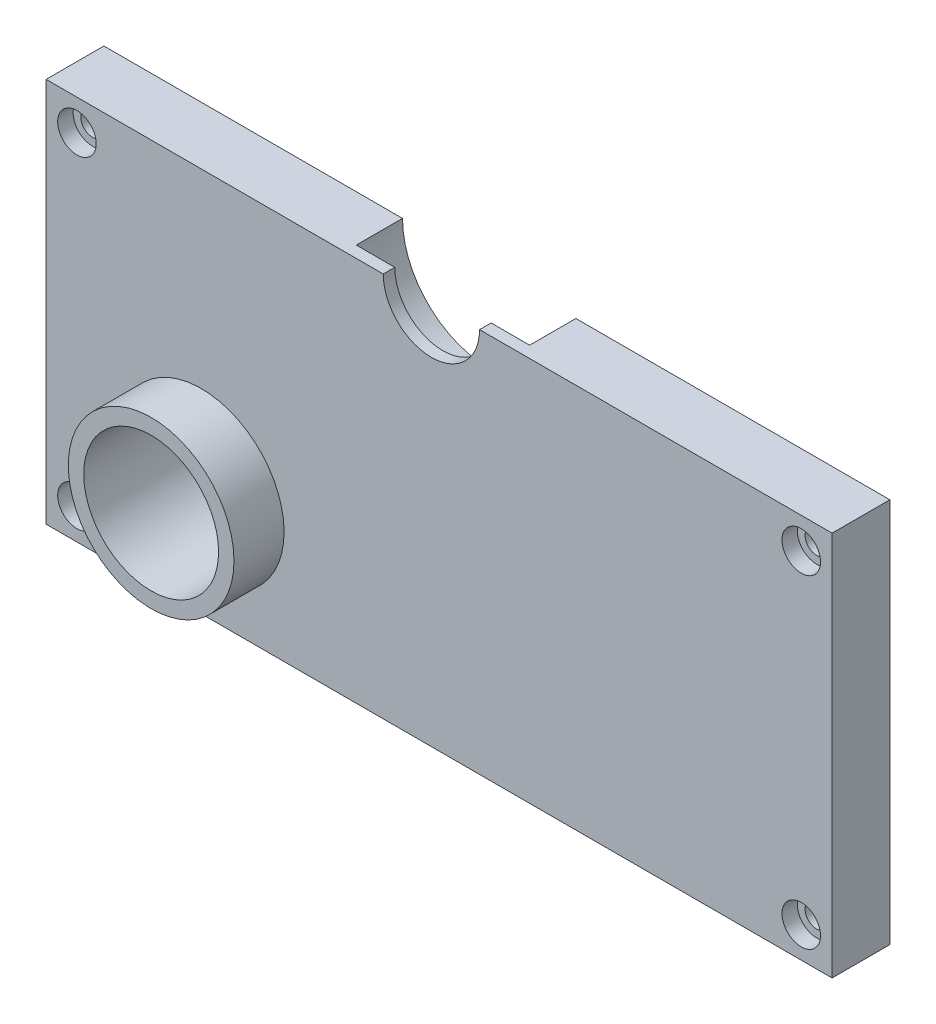
ISO-10303-21;
HEADER;
FILE_DESCRIPTION(('STEP AP214'),'2;1');
FILE_NAME('part.step','',(''),(''),'','','');
FILE_SCHEMA(('AUTOMOTIVE_DESIGN { 1 0 10303 214 1 1 1 1 }'));
ENDSEC;
DATA;
#1=APPLICATION_CONTEXT('core data for automotive mechanical design processes');
#2=APPLICATION_PROTOCOL_DEFINITION('international standard','automotive_design',2000,#1);
#3=PRODUCT_CONTEXT('',#1,'mechanical');
#4=PRODUCT('Part','Part','',(#3));
#5=PRODUCT_RELATED_PRODUCT_CATEGORY('part','',(#4));
#6=PRODUCT_DEFINITION_FORMATION('','',#4);
#7=PRODUCT_DEFINITION_CONTEXT('part definition',#1,'design');
#8=PRODUCT_DEFINITION('design','',#6,#7);
#9=PRODUCT_DEFINITION_SHAPE('','',#8);
#10=(LENGTH_UNIT() NAMED_UNIT(*) SI_UNIT(.MILLI.,.METRE.));
#11=(NAMED_UNIT(*) PLANE_ANGLE_UNIT() SI_UNIT($,.RADIAN.));
#12=(NAMED_UNIT(*) SI_UNIT($,.STERADIAN.) SOLID_ANGLE_UNIT());
#13=UNCERTAINTY_MEASURE_WITH_UNIT(LENGTH_MEASURE(1.E-05),#10,'distance_accuracy_value','');
#14=(GEOMETRIC_REPRESENTATION_CONTEXT(3) GLOBAL_UNCERTAINTY_ASSIGNED_CONTEXT((#13)) GLOBAL_UNIT_ASSIGNED_CONTEXT((#10,
#11,#12)) REPRESENTATION_CONTEXT('',''));
#15=CARTESIAN_POINT('',(0.,0.,0.));
#16=DIRECTION('',(0.,0.,1.));
#17=DIRECTION('',(1.,0.,0.));
#18=AXIS2_PLACEMENT_3D('',#15,#16,#17);
#19=CARTESIAN_POINT('',(-46.,-46.,-5.5));
#20=DIRECTION('',(0.,0.,1.));
#21=DIRECTION('',(1.,0.,0.));
#22=AXIS2_PLACEMENT_3D('',#19,#20,#21);
#23=CYLINDRICAL_SURFACE('',#22,1.5);
#24=CARTESIAN_POINT('',(-46.,-46.,-3.));
#25=DIRECTION('',(0.,0.,-1.));
#26=DIRECTION('',(-1.,0.,0.));
#27=AXIS2_PLACEMENT_3D('',#24,#25,#26);
#28=CIRCLE('',#27,1.5);
#29=CARTESIAN_POINT('',(-47.5,-46.,-3.));
#30=VERTEX_POINT('',#29);
#31=EDGE_CURVE('E275',#30,#30,#28,.T.);
#32=ORIENTED_EDGE('',*,*,#31,.T.);
#33=EDGE_LOOP('',(#32));
#34=FACE_BOUND('',#33,.T.);
#35=CARTESIAN_POINT('',(-46.,-46.,2.5));
#36=DIRECTION('',(0.,0.,1.));
#37=DIRECTION('',(1.,0.,0.));
#38=AXIS2_PLACEMENT_3D('',#35,#36,#37);
#39=CIRCLE('',#38,1.5);
#40=CARTESIAN_POINT('',(-44.5,-46.,2.5));
#41=VERTEX_POINT('',#40);
#42=EDGE_CURVE('E41',#41,#41,#39,.F.);
#43=ORIENTED_EDGE('',*,*,#42,.F.);
#44=EDGE_LOOP('',(#43));
#45=FACE_BOUND('',#44,.T.);
#46=ADVANCED_FACE('F37',(#34,#45),#23,.F.);
#47=CARTESIAN_POINT('',(48.,-46.,-5.5));
#48=DIRECTION('',(0.,0.,1.));
#49=DIRECTION('',(1.,0.,0.));
#50=AXIS2_PLACEMENT_3D('',#47,#48,#49);
#51=CYLINDRICAL_SURFACE('',#50,1.5);
#52=CARTESIAN_POINT('',(48.,-46.,-3.));
#53=DIRECTION('',(0.,0.,-1.));
#54=DIRECTION('',(-1.,0.,0.));
#55=AXIS2_PLACEMENT_3D('',#52,#53,#54);
#56=CIRCLE('',#55,1.5);
#57=CARTESIAN_POINT('',(46.5,-46.,-3.));
#58=VERTEX_POINT('',#57);
#59=EDGE_CURVE('E277',#58,#58,#56,.T.);
#60=ORIENTED_EDGE('',*,*,#59,.T.);
#61=EDGE_LOOP('',(#60));
#62=FACE_BOUND('',#61,.T.);
#63=CARTESIAN_POINT('',(48.,-46.,2.5));
#64=DIRECTION('',(0.,0.,1.));
#65=DIRECTION('',(1.,0.,0.));
#66=AXIS2_PLACEMENT_3D('',#63,#64,#65);
#67=CIRCLE('',#66,1.5);
#68=CARTESIAN_POINT('',(49.5,-46.,2.5));
#69=VERTEX_POINT('',#68);
#70=EDGE_CURVE('E355',#69,#69,#67,.F.);
#71=ORIENTED_EDGE('',*,*,#70,.F.);
#72=EDGE_LOOP('',(#71));
#73=FACE_BOUND('',#72,.T.);
#74=ADVANCED_FACE('F242',(#62,#73),#51,.F.);
#75=CARTESIAN_POINT('',(48.,-4.,-5.5));
#76=DIRECTION('',(0.,0.,1.));
#77=DIRECTION('',(1.,0.,0.));
#78=AXIS2_PLACEMENT_3D('',#75,#76,#77);
#79=CYLINDRICAL_SURFACE('',#78,1.5);
#80=CARTESIAN_POINT('',(48.,-4.,-3.));
#81=DIRECTION('',(0.,0.,-1.));
#82=DIRECTION('',(-1.,0.,0.));
#83=AXIS2_PLACEMENT_3D('',#80,#81,#82);
#84=CIRCLE('',#83,1.5);
#85=CARTESIAN_POINT('',(46.5,-4.,-3.));
#86=VERTEX_POINT('',#85);
#87=EDGE_CURVE('E293',#86,#86,#84,.T.);
#88=ORIENTED_EDGE('',*,*,#87,.T.);
#89=EDGE_LOOP('',(#88));
#90=FACE_BOUND('',#89,.T.);
#91=CARTESIAN_POINT('',(48.,-4.,2.5));
#92=DIRECTION('',(0.,0.,1.));
#93=DIRECTION('',(1.,0.,0.));
#94=AXIS2_PLACEMENT_3D('',#91,#92,#93);
#95=CIRCLE('',#94,1.5);
#96=CARTESIAN_POINT('',(49.5,-4.,2.5));
#97=VERTEX_POINT('',#96);
#98=EDGE_CURVE('E285',#97,#97,#95,.F.);
#99=ORIENTED_EDGE('',*,*,#98,.F.);
#100=EDGE_LOOP('',(#99));
#101=FACE_BOUND('',#100,.T.);
#102=ADVANCED_FACE('F249',(#90,#101),#79,.F.);
#103=CARTESIAN_POINT('',(-46.,-4.,-5.5));
#104=DIRECTION('',(0.,0.,1.));
#105=DIRECTION('',(1.,0.,0.));
#106=AXIS2_PLACEMENT_3D('',#103,#104,#105);
#107=CYLINDRICAL_SURFACE('',#106,1.5);
#108=CARTESIAN_POINT('',(-46.,-4.,-3.));
#109=DIRECTION('',(0.,0.,-1.));
#110=DIRECTION('',(-1.,0.,0.));
#111=AXIS2_PLACEMENT_3D('',#108,#109,#110);
#112=CIRCLE('',#111,1.5);
#113=CARTESIAN_POINT('',(-47.5,-4.,-3.));
#114=VERTEX_POINT('',#113);
#115=EDGE_CURVE('E271',#114,#114,#112,.T.);
#116=ORIENTED_EDGE('',*,*,#115,.T.);
#117=EDGE_LOOP('',(#116));
#118=FACE_BOUND('',#117,.T.);
#119=CARTESIAN_POINT('',(-46.,-4.,2.5));
#120=DIRECTION('',(0.,0.,1.));
#121=DIRECTION('',(1.,0.,0.));
#122=AXIS2_PLACEMENT_3D('',#119,#120,#121);
#123=CIRCLE('',#122,1.5);
#124=CARTESIAN_POINT('',(-44.5,-4.,2.5));
#125=VERTEX_POINT('',#124);
#126=EDGE_CURVE('E192',#125,#125,#123,.F.);
#127=ORIENTED_EDGE('',*,*,#126,.F.);
#128=EDGE_LOOP('',(#127));
#129=FACE_BOUND('',#128,.T.);
#130=ADVANCED_FACE('F259',(#118,#129),#107,.F.);
#131=CARTESIAN_POINT('',(-29.87,-35.43,-13.));
#132=DIRECTION('',(0.,0.,1.));
#133=DIRECTION('',(1.,0.,0.));
#134=AXIS2_PLACEMENT_3D('',#131,#132,#133);
#135=CYLINDRICAL_SURFACE('',#134,10.75);
#136=CARTESIAN_POINT('',(-29.87,-35.43,-3.));
#137=DIRECTION('',(0.,0.,-1.));
#138=DIRECTION('',(-1.,0.,0.));
#139=AXIS2_PLACEMENT_3D('',#136,#137,#138);
#140=CIRCLE('',#139,10.75);
#141=CARTESIAN_POINT('',(-40.62,-35.43,-3.));
#142=VERTEX_POINT('',#141);
#143=EDGE_CURVE('E161',#142,#142,#140,.T.);
#144=ORIENTED_EDGE('',*,*,#143,.T.);
#145=EDGE_LOOP('',(#144));
#146=FACE_BOUND('',#145,.T.);
#147=CARTESIAN_POINT('',(-29.87,-35.43,-13.));
#148=DIRECTION('',(0.,0.,-1.));
#149=DIRECTION('',(-1.,0.,0.));
#150=AXIS2_PLACEMENT_3D('',#147,#148,#149);
#151=CIRCLE('',#150,10.75);
#152=CARTESIAN_POINT('',(-40.62,-35.43,-13.));
#153=VERTEX_POINT('',#152);
#154=EDGE_CURVE('E162',#153,#153,#151,.T.);
#155=ORIENTED_EDGE('',*,*,#154,.F.);
#156=EDGE_LOOP('',(#155));
#157=FACE_BOUND('',#156,.T.);
#158=CARTESIAN_POINT('',(-29.87,-24.68,-11.));
#159=CARTESIAN_POINT('',(-30.0350922923654,-24.6800021699373,-10.9999967115362));
#160=CARTESIAN_POINT('',(-30.2002188455206,-24.6838401379829,-10.9863267377588));
#161=CARTESIAN_POINT('',(-30.5256963325227,-24.6987770769157,-10.9321165777898));
#162=CARTESIAN_POINT('',(-30.6860452563237,-24.7098790600518,-10.8915652443178));
#163=CARTESIAN_POINT('',(-30.9972237276783,-24.7381218354101,-10.7850275451856));
#164=CARTESIAN_POINT('',(-31.1480658729212,-24.7552544291121,-10.7190756997178));
#165=CARTESIAN_POINT('',(-31.4365495233022,-24.79375865675,-10.5637420379839));
#166=CARTESIAN_POINT('',(-31.5741898208151,-24.8151306779356,-10.474358081076));
#167=CARTESIAN_POINT('',(-31.8358299020564,-24.8604183025175,-10.2723216958212));
#168=CARTESIAN_POINT('',(-31.9594498397226,-24.8843805755824,-10.1591878258725));
#169=CARTESIAN_POINT('',(-32.1862315221166,-24.9318561737601,-9.91389107583066));
#170=CARTESIAN_POINT('',(-32.2893903588399,-24.9553694346291,-9.78172549548366));
#171=CARTESIAN_POINT('',(-32.4742257804314,-24.9997678486268,-9.49901995034033));
#172=CARTESIAN_POINT('',(-32.5554558575761,-25.0205944262695,-9.34817800376118));
#173=CARTESIAN_POINT('',(-32.6912482965205,-25.0565710848423,-9.03430166362407));
#174=CARTESIAN_POINT('',(-32.7458161003846,-25.0717223240241,-8.87126976600936));
#175=CARTESIAN_POINT('',(-32.8253976057648,-25.0941493559096,-8.54187019285583));
#176=CARTESIAN_POINT('',(-32.8511042820826,-25.1016094413276,-8.37568280112655));
#177=CARTESIAN_POINT('',(-32.8743956182747,-25.1083593011281,-8.0411996136968));
#178=CARTESIAN_POINT('',(-32.871986079965,-25.107650761117,-7.87290426013658));
#179=CARTESIAN_POINT('',(-32.8396614160702,-25.0983077982643,-7.54447062514526));
#180=CARTESIAN_POINT('',(-32.8105951877985,-25.0899180032174,-7.38424071286977));
#181=CARTESIAN_POINT('',(-32.7271461211682,-25.0665509991549,-7.0710276873053));
#182=CARTESIAN_POINT('',(-32.6727610884589,-25.0515732191726,-6.91804520340877));
#183=CARTESIAN_POINT('',(-32.539550741909,-25.0165100029562,-6.62150621295611));
#184=CARTESIAN_POINT('',(-32.4604359190388,-24.9963645990934,-6.47808715012894));
#185=CARTESIAN_POINT('',(-32.2802134221935,-24.9532670119222,-6.20626718558629));
#186=CARTESIAN_POINT('',(-32.1791010516395,-24.9303142296842,-6.07786950002096));
#187=CARTESIAN_POINT('',(-31.9534578101335,-24.8831791462612,-5.83489912100734));
#188=CARTESIAN_POINT('',(-31.8282169856434,-24.8589822753319,-5.72098757492069));
#189=CARTESIAN_POINT('',(-31.5601115189813,-24.812820559194,-5.51564186187746));
#190=CARTESIAN_POINT('',(-31.4172460455025,-24.7908558193581,-5.42420875577686));
#191=CARTESIAN_POINT('',(-31.1168593107963,-24.7514760261901,-5.2660854221532));
#192=CARTESIAN_POINT('',(-30.959266639728,-24.7340848855177,-5.19952450345814));
#193=CARTESIAN_POINT('',(-30.6345297898376,-24.7059842363693,-5.09403713222929));
#194=CARTESIAN_POINT('',(-30.4673879143707,-24.6952731239753,-5.0551040457644));
#195=CARTESIAN_POINT('',(-30.1339316325878,-24.6819859730551,-5.00703798381508));
#196=CARTESIAN_POINT('',(-29.9677562078677,-24.6791649236079,-4.99700719355867));
#197=CARTESIAN_POINT('',(-29.6360940450443,-24.6812661679615,-5.00453773468952));
#198=CARTESIAN_POINT('',(-29.4706072305774,-24.6861875789029,-5.02209592015277));
#199=CARTESIAN_POINT('',(-29.1482904831243,-24.7030616591184,-5.08357296871057));
#200=CARTESIAN_POINT('',(-28.9913556223533,-24.7148783823179,-5.12698248540721));
#201=CARTESIAN_POINT('',(-28.6870173174317,-24.7441942108344,-5.23833084481536));
#202=CARTESIAN_POINT('',(-28.5396149550039,-24.7616939596939,-5.30627246562606));
#203=CARTESIAN_POINT('',(-28.2551033983786,-24.8009980954043,-5.46636418721516));
#204=CARTESIAN_POINT('',(-28.1182743400229,-24.8228849400784,-5.558991374767));
#205=CARTESIAN_POINT('',(-27.8617897053933,-24.8684381614209,-5.76523258030576));
#206=CARTESIAN_POINT('',(-27.7421378637699,-24.8921049233775,-5.87885114997139));
#207=CARTESIAN_POINT('',(-27.5195579935789,-24.939466567328,-6.12805259041416));
#208=CARTESIAN_POINT('',(-27.4172657194359,-24.9631394381821,-6.26420860577319));
#209=CARTESIAN_POINT('',(-27.2369564240264,-25.0070337649726,-6.5522613418497));
#210=CARTESIAN_POINT('',(-27.1589384865613,-25.0272553511597,-6.70415746819155));
#211=CARTESIAN_POINT('',(-27.0299711390041,-25.0617216729352,-7.01869592749557));
#212=CARTESIAN_POINT('',(-26.9788724758068,-25.0759992702017,-7.18127326311507));
#213=CARTESIAN_POINT('',(-26.9048862198852,-25.0969410603043,-7.51318554799985));
#214=CARTESIAN_POINT('',(-26.8819905651876,-25.1036074288089,-7.68251855182742));
#215=CARTESIAN_POINT('',(-26.8655555621926,-25.1083782052036,-8.01659354537349));
#216=CARTESIAN_POINT('',(-26.870989464452,-25.1067820859822,-8.1812814670416));
#217=CARTESIAN_POINT('',(-26.908652740411,-25.0959156953241,-8.5072931142663));
#218=CARTESIAN_POINT('',(-26.940881295511,-25.0866456583322,-8.66861694244448));
#219=CARTESIAN_POINT('',(-27.0305983433379,-25.0616626307215,-8.98189054210203));
#220=CARTESIAN_POINT('',(-27.0878497560649,-25.0460102014831,-9.13391338530394));
#221=CARTESIAN_POINT('',(-27.2258040177214,-25.0100294388204,-9.42631446334464));
#222=CARTESIAN_POINT('',(-27.3065108548616,-24.9897003103224,-9.56669071264858));
#223=CARTESIAN_POINT('',(-27.4921141277064,-24.945844611131,-9.83666637854878));
#224=CARTESIAN_POINT('',(-27.5977017935733,-24.9222365585735,-9.96577739186617));
#225=CARTESIAN_POINT('',(-27.8287803172517,-24.8749154999014,-10.2047817340942));
#226=CARTESIAN_POINT('',(-27.9542761146524,-24.8512024691628,-10.3146702792759));
#227=CARTESIAN_POINT('',(-28.2252565722007,-24.8056590374746,-10.5147280660428));
#228=CARTESIAN_POINT('',(-28.3711501168408,-24.7838877898094,-10.6043581724661));
#229=CARTESIAN_POINT('',(-28.6765409846609,-24.7453486774041,-10.7576818154286));
#230=CARTESIAN_POINT('',(-28.8360303405778,-24.7285779079083,-10.8213904175286));
#231=CARTESIAN_POINT('',(-29.1405488692496,-24.7038489869529,-10.9136719964019));
#232=CARTESIAN_POINT('',(-29.2843864923586,-24.6949738399839,-10.9459654810403));
#233=CARTESIAN_POINT('',(-29.5754739306286,-24.683048729449,-10.989129659424));
#234=CARTESIAN_POINT('',(-29.7227233326206,-24.6799980642274,-11.0000029335954));
#235=CARTESIAN_POINT('',(-29.87,-24.68,-11.));
#236=B_SPLINE_CURVE_WITH_KNOTS('',3,(#158,#159,#160,#161,#162,#163,#164,#165,#166,#167,#168,
#169,#170,#171,#172,#173,#174,#175,#176,#177,#178,#179,#180,#181,#182,#183,#184,#185,#186,#187,
#188,#189,#190,#191,#192,#193,#194,#195,#196,#197,#198,#199,#200,#201,#202,#203,#204,#205,#206,
#207,#208,#209,#210,#211,#212,#213,#214,#215,#216,#217,#218,#219,#220,#221,#222,#223,#224,#225,
#226,#227,#228,#229,#230,#231,#232,#233,#234,#235),.UNSPECIFIED.,.T.,.F.,(4,2,2,2,2,2,2,2,2,2,2,
2,2,2,2,2,2,2,2,2,2,2,2,2,2,2,2,2,2,2,2,2,2,2,2,2,2,2,4),(0.,0.494736463878204,
0.989678215694692,1.48394968432604,1.97826632289823,2.48378609334166,2.98937765865482,
3.50459744507508,4.01971202547277,4.52217460592407,5.02453350442822,5.51142993191509,
5.99836856599619,6.49123589142707,6.98420854977923,7.49486501747536,8.00554558066099,
8.51884537088073,9.03202186699991,9.5290756583644,10.026072775643,10.5135873226137,
11.001157094719,11.4989354935255,11.9968219553539,12.5101909427327,13.023540551411,
13.5340131290523,14.0443397516234,14.5363020717037,15.0282493624667,15.5156334312274,
16.0031004202002,16.5061614028528,17.0093474003749,17.5246617006683,18.039676071343,
18.4810771554106,18.9224250620092),.UNSPECIFIED.);
#237=CARTESIAN_POINT('',(-29.87,-24.68,-11.));
#238=VERTEX_POINT('',#237);
#239=EDGE_CURVE('E11',#238,#238,#236,.T.);
#240=ORIENTED_EDGE('',*,*,#239,.F.);
#241=EDGE_LOOP('',(#240));
#242=FACE_BOUND('',#241,.T.);
#243=ADVANCED_FACE('F194',(#146,#157,#242),#135,.T.);
#244=CARTESIAN_POINT('',(0.,0.,-3.));
#245=DIRECTION('',(0.,0.,-1.));
#246=DIRECTION('',(-1.,0.,0.));
#247=AXIS2_PLACEMENT_3D('',#244,#245,#246);
#248=PLANE('',#247);
#249=ORIENTED_EDGE('',*,*,#31,.F.);
#250=EDGE_LOOP('',(#249));
#251=FACE_BOUND('',#250,.T.);
#252=ORIENTED_EDGE('',*,*,#59,.F.);
#253=EDGE_LOOP('',(#252));
#254=FACE_BOUND('',#253,.T.);
#255=ORIENTED_EDGE('',*,*,#87,.F.);
#256=EDGE_LOOP('',(#255));
#257=FACE_BOUND('',#256,.T.);
#258=ORIENTED_EDGE('',*,*,#115,.F.);
#259=EDGE_LOOP('',(#258));
#260=FACE_BOUND('',#259,.T.);
#261=DIRECTION('',(0.,1.,0.));
#262=VECTOR('',#261,1.);
#263=CARTESIAN_POINT('',(52.,0.,-3.));
#264=LINE('',#263,#262);
#265=CARTESIAN_POINT('',(52.,-50.,-3.));
#266=VERTEX_POINT('',#265);
#267=CARTESIAN_POINT('',(52.,0.,-3.));
#268=VERTEX_POINT('',#267);
#269=EDGE_CURVE('E118',#266,#268,#264,.T.);
#270=ORIENTED_EDGE('',*,*,#269,.F.);
#271=DIRECTION('',(-1.,0.,0.));
#272=VECTOR('',#271,1.);
#273=CARTESIAN_POINT('',(70.,-50.,-3.));
#274=LINE('',#273,#272);
#275=CARTESIAN_POINT('',(-50.,-50.,-3.));
#276=VERTEX_POINT('',#275);
#277=EDGE_CURVE('E117',#266,#276,#274,.T.);
#278=ORIENTED_EDGE('',*,*,#277,.T.);
#279=DIRECTION('',(0.,1.,0.));
#280=VECTOR('',#279,1.);
#281=CARTESIAN_POINT('',(-50.,-50.,-3.));
#282=LINE('',#281,#280);
#283=CARTESIAN_POINT('',(-50.,0.,-3.));
#284=VERTEX_POINT('',#283);
#285=EDGE_CURVE('E174',#276,#284,#282,.T.);
#286=ORIENTED_EDGE('',*,*,#285,.T.);
#287=DIRECTION('',(1.,0.,0.));
#288=VECTOR('',#287,1.);
#289=CARTESIAN_POINT('',(-50.,0.,-3.));
#290=LINE('',#289,#288);
#291=CARTESIAN_POINT('',(-11.25,0.,-3.));
#292=VERTEX_POINT('',#291);
#293=EDGE_CURVE('E177',#284,#292,#290,.T.);
#294=ORIENTED_EDGE('',*,*,#293,.T.);
#295=CARTESIAN_POINT('',(0.,0.,-3.));
#296=DIRECTION('',(0.,0.,1.));
#297=DIRECTION('',(-1.,0.,0.));
#298=AXIS2_PLACEMENT_3D('',#295,#296,#297);
#299=CIRCLE('',#298,11.25);
#300=CARTESIAN_POINT('',(11.25,0.,-3.));
#301=VERTEX_POINT('',#300);
#302=EDGE_CURVE('E165',#292,#301,#299,.T.);
#303=ORIENTED_EDGE('',*,*,#302,.T.);
#304=DIRECTION('',(1.,0.,0.));
#305=VECTOR('',#304,1.);
#306=CARTESIAN_POINT('',(11.25,0.,-3.));
#307=LINE('',#306,#305);
#308=EDGE_CURVE('E170',#301,#268,#307,.T.);
#309=ORIENTED_EDGE('',*,*,#308,.T.);
#310=EDGE_LOOP('',(#270,#278,#286,#294,#303,#309));
#311=FACE_BOUND('',#310,.T.);
#312=ORIENTED_EDGE('',*,*,#143,.F.);
#313=EDGE_LOOP('',(#312));
#314=FACE_BOUND('',#313,.T.);
#315=ADVANCED_FACE('F266',(#251,#254,#257,#260,#311,#314),#248,.T.);
#316=CARTESIAN_POINT('',(0.,0.,110.));
#317=DIRECTION('',(0.,1.,0.));
#318=DIRECTION('',(0.,0.,1.));
#319=AXIS2_PLACEMENT_3D('',#316,#317,#318);
#320=PLANE('',#319);
#321=DIRECTION('',(0.,0.,-1.));
#322=VECTOR('',#321,1.);
#323=CARTESIAN_POINT('',(-50.,0.,110.));
#324=LINE('',#323,#322);
#325=CARTESIAN_POINT('',(-50.,0.,4.5));
#326=VERTEX_POINT('',#325);
#327=EDGE_CURVE('E185',#326,#284,#324,.T.);
#328=ORIENTED_EDGE('',*,*,#327,.F.);
#329=DIRECTION('',(-1.,0.,0.));
#330=VECTOR('',#329,1.);
#331=CARTESIAN_POINT('',(-11.25,0.,4.5));
#332=LINE('',#331,#330);
#333=CARTESIAN_POINT('',(-6.25,0.,4.5));
#334=VERTEX_POINT('',#333);
#335=EDGE_CURVE('E139',#334,#326,#332,.T.);
#336=ORIENTED_EDGE('',*,*,#335,.F.);
#337=DIRECTION('',(0.,0.,-1.));
#338=VECTOR('',#337,1.);
#339=CARTESIAN_POINT('',(-6.25,0.,4.5));
#340=LINE('',#339,#338);
#341=CARTESIAN_POINT('',(-6.25,0.,3.));
#342=VERTEX_POINT('',#341);
#343=EDGE_CURVE('E142',#334,#342,#340,.T.);
#344=ORIENTED_EDGE('',*,*,#343,.T.);
#345=DIRECTION('',(-1.,0.,0.));
#346=VECTOR('',#345,1.);
#347=CARTESIAN_POINT('',(-11.25,0.,3.));
#348=LINE('',#347,#346);
#349=CARTESIAN_POINT('',(-11.25,0.,3.));
#350=VERTEX_POINT('',#349);
#351=EDGE_CURVE('E127',#342,#350,#348,.T.);
#352=ORIENTED_EDGE('',*,*,#351,.T.);
#353=DIRECTION('',(0.,0.,-1.));
#354=VECTOR('',#353,1.);
#355=CARTESIAN_POINT('',(-11.25,0.,110.));
#356=LINE('',#355,#354);
#357=EDGE_CURVE('E46',#350,#292,#356,.T.);
#358=ORIENTED_EDGE('',*,*,#357,.T.);
#359=ORIENTED_EDGE('',*,*,#293,.F.);
#360=EDGE_LOOP('',(#328,#336,#344,#352,#358,#359));
#361=FACE_BOUND('',#360,.T.);
#362=ADVANCED_FACE('F471',(#361),#320,.T.);
#363=CARTESIAN_POINT('',(-50.,0.,110.));
#364=DIRECTION('',(1.,0.,0.));
#365=DIRECTION('',(0.,1.,0.));
#366=AXIS2_PLACEMENT_3D('',#363,#364,#365);
#367=PLANE('',#366);
#368=DIRECTION('',(0.,0.,-1.));
#369=VECTOR('',#368,1.);
#370=CARTESIAN_POINT('',(-50.,-50.,110.));
#371=LINE('',#370,#369);
#372=CARTESIAN_POINT('',(-50.,-50.,4.5));
#373=VERTEX_POINT('',#372);
#374=EDGE_CURVE('E183',#373,#276,#371,.T.);
#375=ORIENTED_EDGE('',*,*,#374,.F.);
#376=DIRECTION('',(0.,-1.,0.));
#377=VECTOR('',#376,1.);
#378=CARTESIAN_POINT('',(-50.,0.,4.5));
#379=LINE('',#378,#377);
#380=EDGE_CURVE('E125',#326,#373,#379,.T.);
#381=ORIENTED_EDGE('',*,*,#380,.F.);
#382=ORIENTED_EDGE('',*,*,#327,.T.);
#383=ORIENTED_EDGE('',*,*,#285,.F.);
#384=EDGE_LOOP('',(#375,#381,#382,#383));
#385=FACE_BOUND('',#384,.T.);
#386=ADVANCED_FACE('F494',(#385),#367,.F.);
#387=CARTESIAN_POINT('',(0.,-50.,110.));
#388=DIRECTION('',(0.,1.,0.));
#389=DIRECTION('',(0.,0.,1.));
#390=AXIS2_PLACEMENT_3D('',#387,#388,#389);
#391=PLANE('',#390);
#392=ORIENTED_EDGE('',*,*,#277,.F.);
#393=DIRECTION('',(0.,0.,1.));
#394=VECTOR('',#393,1.);
#395=CARTESIAN_POINT('',(52.,-50.,-35.));
#396=LINE('',#395,#394);
#397=CARTESIAN_POINT('',(52.,-50.,4.5));
#398=VERTEX_POINT('',#397);
#399=EDGE_CURVE('E104',#266,#398,#396,.T.);
#400=ORIENTED_EDGE('',*,*,#399,.T.);
#401=DIRECTION('',(1.,0.,0.));
#402=VECTOR('',#401,1.);
#403=CARTESIAN_POINT('',(-50.,-50.,4.5));
#404=LINE('',#403,#402);
#405=EDGE_CURVE('E116',#373,#398,#404,.T.);
#406=ORIENTED_EDGE('',*,*,#405,.F.);
#407=ORIENTED_EDGE('',*,*,#374,.T.);
#408=EDGE_LOOP('',(#392,#400,#406,#407));
#409=FACE_BOUND('',#408,.T.);
#410=ADVANCED_FACE('F114',(#409),#391,.F.);
#411=DIRECTION('',(0.,0.,1.));
#412=VECTOR('',#411,1.);
#413=CARTESIAN_POINT('',(52.,0.,-35.));
#414=LINE('',#413,#412);
#415=CARTESIAN_POINT('',(52.,0.,4.5));
#416=VERTEX_POINT('',#415);
#417=EDGE_CURVE('E54',#268,#416,#414,.T.);
#418=ORIENTED_EDGE('',*,*,#417,.F.);
#419=ORIENTED_EDGE('',*,*,#308,.F.);
#420=DIRECTION('',(0.,0.,-1.));
#421=VECTOR('',#420,1.);
#422=CARTESIAN_POINT('',(11.25,0.,110.));
#423=LINE('',#422,#421);
#424=CARTESIAN_POINT('',(11.25,0.,3.));
#425=VERTEX_POINT('',#424);
#426=EDGE_CURVE('E181',#425,#301,#423,.T.);
#427=ORIENTED_EDGE('',*,*,#426,.F.);
#428=DIRECTION('',(-1.,0.,0.));
#429=VECTOR('',#428,1.);
#430=CARTESIAN_POINT('',(6.25,0.,3.));
#431=LINE('',#430,#429);
#432=CARTESIAN_POINT('',(6.25,0.,3.));
#433=VERTEX_POINT('',#432);
#434=EDGE_CURVE('E143',#425,#433,#431,.T.);
#435=ORIENTED_EDGE('',*,*,#434,.T.);
#436=DIRECTION('',(0.,0.,-1.));
#437=VECTOR('',#436,1.);
#438=CARTESIAN_POINT('',(6.25,0.,4.5));
#439=LINE('',#438,#437);
#440=CARTESIAN_POINT('',(6.25,0.,4.5));
#441=VERTEX_POINT('',#440);
#442=EDGE_CURVE('E149',#441,#433,#439,.T.);
#443=ORIENTED_EDGE('',*,*,#442,.F.);
#444=DIRECTION('',(-1.,0.,0.));
#445=VECTOR('',#444,1.);
#446=CARTESIAN_POINT('',(70.,0.,4.5));
#447=LINE('',#446,#445);
#448=EDGE_CURVE('E126',#416,#441,#447,.T.);
#449=ORIENTED_EDGE('',*,*,#448,.F.);
#450=EDGE_LOOP('',(#418,#419,#427,#435,#443,#449));
#451=FACE_BOUND('',#450,.T.);
#452=ADVANCED_FACE('F483',(#451),#320,.T.);
#453=CARTESIAN_POINT('',(0.,0.,110.));
#454=DIRECTION('',(0.,0.,-1.));
#455=DIRECTION('',(-1.,0.,0.));
#456=AXIS2_PLACEMENT_3D('',#453,#454,#455);
#457=CYLINDRICAL_SURFACE('',#456,11.25);
#458=CARTESIAN_POINT('',(0.,0.,3.));
#459=DIRECTION('',(0.,0.,-1.));
#460=DIRECTION('',(-1.,0.,0.));
#461=AXIS2_PLACEMENT_3D('',#458,#459,#460);
#462=CIRCLE('',#461,11.25);
#463=EDGE_CURVE('E62',#425,#350,#462,.T.);
#464=ORIENTED_EDGE('',*,*,#463,.F.);
#465=ORIENTED_EDGE('',*,*,#426,.T.);
#466=ORIENTED_EDGE('',*,*,#302,.F.);
#467=ORIENTED_EDGE('',*,*,#357,.F.);
#468=EDGE_LOOP('',(#464,#465,#466,#467));
#469=FACE_BOUND('',#468,.T.);
#470=ADVANCED_FACE('F39',(#469),#457,.F.);
#471=CARTESIAN_POINT('',(-29.87,-35.43,7.));
#472=DIRECTION('',(0.,0.,-1.));
#473=DIRECTION('',(-1.,0.,0.));
#474=AXIS2_PLACEMENT_3D('',#471,#472,#473);
#475=CYLINDRICAL_SURFACE('',#474,8.75);
#476=CARTESIAN_POINT('',(-29.87,-26.68,-6.5));
#477=CARTESIAN_POINT('',(-29.9535989442386,-26.6800014546683,-6.50000331998612));
#478=CARTESIAN_POINT('',(-30.0372426290716,-26.6812105329209,-6.5070123945573));
#479=CARTESIAN_POINT('',(-30.2021816278855,-26.6859173346065,-6.53485045021775));
#480=CARTESIAN_POINT('',(-30.2834747519211,-26.6894171247638,-6.55569191138983));
#481=CARTESIAN_POINT('',(-30.4413026450667,-26.6983130318723,-6.61054495697617));
#482=CARTESIAN_POINT('',(-30.517841333713,-26.7037075617203,-6.64454552126585));
#483=CARTESIAN_POINT('',(-30.6641183686236,-26.7158006959179,-6.72472222011683));
#484=CARTESIAN_POINT('',(-30.7338574413995,-26.7224991607178,-6.77089705194951));
#485=CARTESIAN_POINT('',(-30.8652684399076,-26.7365338709729,-6.8746069264191));
#486=CARTESIAN_POINT('',(-30.9268618079566,-26.7438753307604,-6.93224081456469));
#487=CARTESIAN_POINT('',(-31.0395541744121,-26.7583289601225,-7.05702004931476));
#488=CARTESIAN_POINT('',(-31.0906524912359,-26.7654411147798,-7.12416601318619));
#489=CARTESIAN_POINT('',(-31.1812217171384,-26.7786813971236,-7.26660644468812));
#490=CARTESIAN_POINT('',(-31.2206144521631,-26.7848027898712,-7.34195129921876));
#491=CARTESIAN_POINT('',(-31.2861542755797,-26.7952958557686,-7.49831131353582));
#492=CARTESIAN_POINT('',(-31.3123023121195,-26.799667654162,-7.5793260669586));
#493=CARTESIAN_POINT('',(-31.3503619578066,-26.8061144984044,-7.7438916582515));
#494=CARTESIAN_POINT('',(-31.3624095023718,-26.8082114601215,-7.82741018292065));
#495=CARTESIAN_POINT('',(-31.3723477505828,-26.8099374496971,-7.99530756745906));
#496=CARTESIAN_POINT('',(-31.370239514168,-26.8095666623327,-8.07968636244165));
#497=CARTESIAN_POINT('',(-31.3520366598552,-26.8064190456365,-8.2459355699223));
#498=CARTESIAN_POINT('',(-31.3360951512852,-26.8036685562857,-8.32782331808925));
#499=CARTESIAN_POINT('',(-31.290918738933,-26.7961127078678,-8.48774445821403));
#500=CARTESIAN_POINT('',(-31.2616833551891,-26.7913072746095,-8.56577771089647));
#501=CARTESIAN_POINT('',(-31.1905950553493,-26.7801547366039,-8.71623087162337));
#502=CARTESIAN_POINT('',(-31.1486789455189,-26.7737999422147,-8.78862032751243));
#503=CARTESIAN_POINT('',(-31.0534638657786,-26.7602699880903,-8.92539623512292));
#504=CARTESIAN_POINT('',(-31.0001639251927,-26.7530947584226,-8.98978200364521));
#505=CARTESIAN_POINT('',(-30.882861861498,-26.7386168728747,-9.10960877797543));
#506=CARTESIAN_POINT('',(-30.818728459636,-26.731313780534,-9.16492129877096));
#507=CARTESIAN_POINT('',(-30.6820229424797,-26.7174899796245,-9.26401972561583));
#508=CARTESIAN_POINT('',(-30.6094507668085,-26.7109692766542,-9.30780554918786));
#509=CARTESIAN_POINT('',(-30.4578040670193,-26.6994348942743,-9.38262092454521));
#510=CARTESIAN_POINT('',(-30.378723613882,-26.6944226088212,-9.41363868680286));
#511=CARTESIAN_POINT('',(-30.2163704223978,-26.6864808987573,-9.46191590133845));
#512=CARTESIAN_POINT('',(-30.133098056045,-26.6835512896757,-9.47917657215192));
#513=CARTESIAN_POINT('',(-29.9658318104734,-26.6801299416305,-9.49927444244929));
#514=CARTESIAN_POINT('',(-29.8818597040844,-26.6796084047716,-9.50228794999791));
#515=CARTESIAN_POINT('',(-29.7146107047184,-26.6809801977988,-9.49427662572732));
#516=CARTESIAN_POINT('',(-29.6313337835246,-26.6828734291879,-9.48325236650094));
#517=CARTESIAN_POINT('',(-29.4683868660943,-26.6888435628619,-9.4476250839372));
#518=CARTESIAN_POINT('',(-29.3886971312798,-26.6929063553335,-9.42310976902901));
#519=CARTESIAN_POINT('',(-29.2345587345103,-26.7027619213896,-9.36129008351292));
#520=CARTESIAN_POINT('',(-29.1601103811816,-26.708554796741,-9.32398496056543));
#521=CARTESIAN_POINT('',(-29.0178051535477,-26.7213019829285,-9.23724379156289));
#522=CARTESIAN_POINT('',(-28.9500160310898,-26.7282665956814,-9.18769813715882));
#523=CARTESIAN_POINT('',(-28.823651236798,-26.742554712087,-9.0780325588378));
#524=CARTESIAN_POINT('',(-28.7650762761754,-26.7498782433864,-9.0179118194222));
#525=CARTESIAN_POINT('',(-28.6581453854048,-26.7641556939664,-8.88801025571645));
#526=CARTESIAN_POINT('',(-28.6099088479673,-26.7711046661725,-8.81813052060073));
#527=CARTESIAN_POINT('',(-28.5258591140213,-26.7837522977592,-8.67115638669697));
#528=CARTESIAN_POINT('',(-28.4900455075177,-26.7894509984004,-8.59406222611395));
#529=CARTESIAN_POINT('',(-28.432034804669,-26.7989153615182,-8.43517475985225));
#530=CARTESIAN_POINT('',(-28.4097793124411,-26.8026893024746,-8.35340329041094));
#531=CARTESIAN_POINT('',(-28.3793335634471,-26.807897223471,-8.18721226709615));
#532=CARTESIAN_POINT('',(-28.371142005704,-26.8093314199474,-8.10279295889536));
#533=CARTESIAN_POINT('',(-28.3690945372111,-26.8096877718996,-7.93489559430545));
#534=CARTESIAN_POINT('',(-28.3750506180325,-26.8086428723774,-7.85141984133967));
#535=CARTESIAN_POINT('',(-28.4007217092917,-26.8042311548902,-7.68667724186214));
#536=CARTESIAN_POINT('',(-28.4204366675202,-26.8008643457359,-7.60541038696973));
#537=CARTESIAN_POINT('',(-28.4729922228113,-26.7922009832273,-7.44747139074579));
#538=CARTESIAN_POINT('',(-28.5058157153053,-26.7869069453956,-7.37079341099298));
#539=CARTESIAN_POINT('',(-28.5836370413061,-26.7749833509741,-7.22400222284267));
#540=CARTESIAN_POINT('',(-28.6286355357169,-26.7683537218885,-7.1538893711027));
#541=CARTESIAN_POINT('',(-28.7301967357279,-26.7544019620835,-7.02127054486712));
#542=CARTESIAN_POINT('',(-28.7868974436808,-26.747072186725,-6.95887104271867));
#543=CARTESIAN_POINT('',(-28.9099631438062,-26.7326061437142,-6.8444083694159));
#544=CARTESIAN_POINT('',(-28.9763303598728,-26.7254699210401,-6.79234758333657));
#545=CARTESIAN_POINT('',(-29.1174261608134,-26.7121340724088,-6.6996885389346));
#546=CARTESIAN_POINT('',(-29.1922126167003,-26.7059417159926,-6.65917734310001));
#547=CARTESIAN_POINT('',(-29.3476065661129,-26.6952620466973,-6.59135615819868));
#548=CARTESIAN_POINT('',(-29.4282082434897,-26.6907730575596,-6.56403318355575));
#549=CARTESIAN_POINT('',(-29.5692560346601,-26.6849715548913,-6.52921156645172));
#550=CARTESIAN_POINT('',(-29.6288547515949,-26.6831173084995,-6.51827502555407));
#551=CARTESIAN_POINT('',(-29.7489611717199,-26.6806310159357,-6.5036681088703));
#552=CARTESIAN_POINT('',(-29.8094688577533,-26.6799989467243,-6.49999759611137));
#553=CARTESIAN_POINT('',(-29.87,-26.68,-6.5));
#554=B_SPLINE_CURVE_WITH_KNOTS('',3,(#476,#477,#478,#479,#480,#481,#482,#483,#484,#485,#486,
#487,#488,#489,#490,#491,#492,#493,#494,#495,#496,#497,#498,#499,#500,#501,#502,#503,#504,#505,
#506,#507,#508,#509,#510,#511,#512,#513,#514,#515,#516,#517,#518,#519,#520,#521,#522,#523,#524,
#525,#526,#527,#528,#529,#530,#531,#532,#533,#534,#535,#536,#537,#538,#539,#540,#541,#542,#543,
#544,#545,#546,#547,#548,#549,#550,#551,#552,#553),.UNSPECIFIED.,.T.,.F.,(4,2,2,2,2,2,2,2,2,2,2,
2,2,2,2,2,2,2,2,2,2,2,2,2,2,2,2,2,2,2,2,2,2,2,2,2,2,2,4),(0.,0.2505755508786,0.50137748803561,
0.751969843365164,1.00253539450022,1.25536421770615,1.50820945525041,1.76270717478227,
2.01718667301528,2.2691921157789,2.52117868939363,2.77041129544867,3.01965290050546,
3.27015764139127,3.52068375083729,3.77449786345848,4.02831379215347,4.28236356164806,
4.5363908261613,4.78726613745983,5.0381312160195,5.28738430760507,5.53665206361355,
5.78823838646018,6.03984411892217,6.2942152362044,6.54857795765346,6.80183722664439,
7.0550730667544,7.30496251367268,7.55485101236711,7.80441450581765,8.05399154921283,
8.30669980095773,8.5594662833132,8.81409060872386,9.06846370822282,9.24990033265442,
9.43133353676861),.UNSPECIFIED.);
#555=CARTESIAN_POINT('',(-29.87,-26.68,-6.5));
#556=VERTEX_POINT('',#555);
#557=EDGE_CURVE('E109',#556,#556,#554,.T.);
#558=ORIENTED_EDGE('',*,*,#557,.F.);
#559=EDGE_LOOP('',(#558));
#560=FACE_BOUND('',#559,.T.);
#561=CARTESIAN_POINT('',(-29.87,-35.43,-13.));
#562=DIRECTION('',(0.,0.,-1.));
#563=DIRECTION('',(-1.,0.,0.));
#564=AXIS2_PLACEMENT_3D('',#561,#562,#563);
#565=CIRCLE('',#564,8.75);
#566=CARTESIAN_POINT('',(-38.62,-35.43,-13.));
#567=VERTEX_POINT('',#566);
#568=EDGE_CURVE('E158',#567,#567,#565,.T.);
#569=ORIENTED_EDGE('',*,*,#568,.T.);
#570=EDGE_LOOP('',(#569));
#571=FACE_BOUND('',#570,.T.);
#572=CARTESIAN_POINT('',(-29.87,-35.43,11.));
#573=DIRECTION('',(0.,0.,1.));
#574=DIRECTION('',(1.,0.,0.));
#575=AXIS2_PLACEMENT_3D('',#572,#573,#574);
#576=CIRCLE('',#575,8.75);
#577=CARTESIAN_POINT('',(-21.12,-35.43,11.));
#578=VERTEX_POINT('',#577);
#579=EDGE_CURVE('E152',#578,#578,#576,.T.);
#580=ORIENTED_EDGE('',*,*,#579,.T.);
#581=EDGE_LOOP('',(#580));
#582=FACE_BOUND('',#581,.T.);
#583=ADVANCED_FACE('F465',(#560,#571,#582),#475,.F.);
#584=CARTESIAN_POINT('',(-29.87,-35.43,-13.));
#585=DIRECTION('',(0.,0.,-1.));
#586=DIRECTION('',(-1.,0.,0.));
#587=AXIS2_PLACEMENT_3D('',#584,#585,#586);
#588=PLANE('',#587);
#589=ORIENTED_EDGE('',*,*,#154,.T.);
#590=EDGE_LOOP('',(#589));
#591=FACE_BOUND('',#590,.T.);
#592=ORIENTED_EDGE('',*,*,#568,.F.);
#593=EDGE_LOOP('',(#592));
#594=FACE_BOUND('',#593,.T.);
#595=ADVANCED_FACE('F469',(#591,#594),#588,.T.);
#596=CARTESIAN_POINT('',(-29.87,-35.43,11.));
#597=DIRECTION('',(0.,0.,1.));
#598=DIRECTION('',(1.,0.,0.));
#599=AXIS2_PLACEMENT_3D('',#596,#597,#598);
#600=PLANE('',#599);
#601=CARTESIAN_POINT('',(-29.87,-35.43,11.));
#602=DIRECTION('',(0.,0.,1.));
#603=DIRECTION('',(1.,0.,0.));
#604=AXIS2_PLACEMENT_3D('',#601,#602,#603);
#605=CIRCLE('',#604,10.75);
#606=CARTESIAN_POINT('',(-19.12,-35.43,11.));
#607=VERTEX_POINT('',#606);
#608=EDGE_CURVE('E155',#607,#607,#605,.T.);
#609=ORIENTED_EDGE('',*,*,#608,.T.);
#610=EDGE_LOOP('',(#609));
#611=FACE_BOUND('',#610,.T.);
#612=ORIENTED_EDGE('',*,*,#579,.F.);
#613=EDGE_LOOP('',(#612));
#614=FACE_BOUND('',#613,.T.);
#615=ADVANCED_FACE('F237',(#611,#614),#600,.T.);
#616=CARTESIAN_POINT('',(-29.87,-35.43,11.));
#617=DIRECTION('',(0.,0.,-1.));
#618=DIRECTION('',(-1.,0.,0.));
#619=AXIS2_PLACEMENT_3D('',#616,#617,#618);
#620=CYLINDRICAL_SURFACE('',#619,10.75);
#621=CARTESIAN_POINT('',(-29.87,-35.43,4.5));
#622=DIRECTION('',(0.,0.,1.));
#623=DIRECTION('',(1.,0.,0.));
#624=AXIS2_PLACEMENT_3D('',#621,#622,#623);
#625=CIRCLE('',#624,10.75);
#626=CARTESIAN_POINT('',(-19.12,-35.43,4.5));
#627=VERTEX_POINT('',#626);
#628=EDGE_CURVE('E135',#627,#627,#625,.T.);
#629=ORIENTED_EDGE('',*,*,#628,.T.);
#630=EDGE_LOOP('',(#629));
#631=FACE_BOUND('',#630,.T.);
#632=ORIENTED_EDGE('',*,*,#608,.F.);
#633=EDGE_LOOP('',(#632));
#634=FACE_BOUND('',#633,.T.);
#635=ADVANCED_FACE('F222',(#631,#634),#620,.T.);
#636=CARTESIAN_POINT('',(0.,0.,4.5));
#637=DIRECTION('',(0.,0.,1.));
#638=DIRECTION('',(1.,0.,0.));
#639=AXIS2_PLACEMENT_3D('',#636,#637,#638);
#640=PLANE('',#639);
#641=CARTESIAN_POINT('',(-46.,-46.,4.5));
#642=DIRECTION('',(0.,0.,1.));
#643=DIRECTION('',(1.,0.,0.));
#644=AXIS2_PLACEMENT_3D('',#641,#642,#643);
#645=CIRCLE('',#644,2.5);
#646=CARTESIAN_POINT('',(-43.5,-46.,4.5));
#647=VERTEX_POINT('',#646);
#648=EDGE_CURVE('E349',#647,#647,#645,.T.);
#649=ORIENTED_EDGE('',*,*,#648,.F.);
#650=EDGE_LOOP('',(#649));
#651=FACE_BOUND('',#650,.T.);
#652=CARTESIAN_POINT('',(48.,-46.,4.5));
#653=DIRECTION('',(0.,0.,1.));
#654=DIRECTION('',(1.,0.,0.));
#655=AXIS2_PLACEMENT_3D('',#652,#653,#654);
#656=CIRCLE('',#655,2.5);
#657=CARTESIAN_POINT('',(50.5,-46.,4.5));
#658=VERTEX_POINT('',#657);
#659=EDGE_CURVE('E345',#658,#658,#656,.T.);
#660=ORIENTED_EDGE('',*,*,#659,.F.);
#661=EDGE_LOOP('',(#660));
#662=FACE_BOUND('',#661,.T.);
#663=CARTESIAN_POINT('',(48.,-4.,4.5));
#664=DIRECTION('',(0.,0.,1.));
#665=DIRECTION('',(1.,0.,0.));
#666=AXIS2_PLACEMENT_3D('',#663,#664,#665);
#667=CIRCLE('',#666,2.5);
#668=CARTESIAN_POINT('',(50.5,-4.,4.5));
#669=VERTEX_POINT('',#668);
#670=EDGE_CURVE('E288',#669,#669,#667,.T.);
#671=ORIENTED_EDGE('',*,*,#670,.F.);
#672=EDGE_LOOP('',(#671));
#673=FACE_BOUND('',#672,.T.);
#674=CARTESIAN_POINT('',(-46.,-4.,4.5));
#675=DIRECTION('',(0.,0.,1.));
#676=DIRECTION('',(1.,0.,0.));
#677=AXIS2_PLACEMENT_3D('',#674,#675,#676);
#678=CIRCLE('',#677,2.5);
#679=CARTESIAN_POINT('',(-43.5,-4.,4.5));
#680=VERTEX_POINT('',#679);
#681=EDGE_CURVE('E280',#680,#680,#678,.T.);
#682=ORIENTED_EDGE('',*,*,#681,.F.);
#683=EDGE_LOOP('',(#682));
#684=FACE_BOUND('',#683,.T.);
#685=DIRECTION('',(0.,-1.,0.));
#686=VECTOR('',#685,1.);
#687=CARTESIAN_POINT('',(52.,-50.,4.5));
#688=LINE('',#687,#686);
#689=EDGE_CURVE('E101',#416,#398,#688,.T.);
#690=ORIENTED_EDGE('',*,*,#689,.F.);
#691=ORIENTED_EDGE('',*,*,#448,.T.);
#692=CARTESIAN_POINT('',(0.,0.,4.5));
#693=DIRECTION('',(0.,0.,-1.));
#694=DIRECTION('',(1.,0.,0.));
#695=AXIS2_PLACEMENT_3D('',#692,#693,#694);
#696=CIRCLE('',#695,6.25);
#697=EDGE_CURVE('E129',#441,#334,#696,.T.);
#698=ORIENTED_EDGE('',*,*,#697,.T.);
#699=ORIENTED_EDGE('',*,*,#335,.T.);
#700=ORIENTED_EDGE('',*,*,#380,.T.);
#701=ORIENTED_EDGE('',*,*,#405,.T.);
#702=EDGE_LOOP('',(#690,#691,#698,#699,#700,#701));
#703=FACE_BOUND('',#702,.T.);
#704=ORIENTED_EDGE('',*,*,#628,.F.);
#705=EDGE_LOOP('',(#704));
#706=FACE_BOUND('',#705,.T.);
#707=ADVANCED_FACE('F121',(#651,#662,#673,#684,#703,#706),#640,.T.);
#708=CARTESIAN_POINT('',(0.,0.,3.));
#709=DIRECTION('',(0.,0.,1.));
#710=DIRECTION('',(1.,0.,0.));
#711=AXIS2_PLACEMENT_3D('',#708,#709,#710);
#712=PLANE('',#711);
#713=ORIENTED_EDGE('',*,*,#463,.T.);
#714=ORIENTED_EDGE('',*,*,#351,.F.);
#715=CARTESIAN_POINT('',(0.,0.,3.));
#716=DIRECTION('',(0.,0.,-1.));
#717=DIRECTION('',(1.,0.,0.));
#718=AXIS2_PLACEMENT_3D('',#715,#716,#717);
#719=CIRCLE('',#718,6.25);
#720=EDGE_CURVE('E132',#433,#342,#719,.T.);
#721=ORIENTED_EDGE('',*,*,#720,.F.);
#722=ORIENTED_EDGE('',*,*,#434,.F.);
#723=EDGE_LOOP('',(#713,#714,#721,#722));
#724=FACE_BOUND('',#723,.T.);
#725=ADVANCED_FACE('F225',(#724),#712,.F.);
#726=CARTESIAN_POINT('',(0.,0.,4.5));
#727=DIRECTION('',(0.,0.,-1.));
#728=DIRECTION('',(-1.,0.,0.));
#729=AXIS2_PLACEMENT_3D('',#726,#727,#728);
#730=CYLINDRICAL_SURFACE('',#729,6.25);
#731=ORIENTED_EDGE('',*,*,#720,.T.);
#732=ORIENTED_EDGE('',*,*,#343,.F.);
#733=ORIENTED_EDGE('',*,*,#697,.F.);
#734=ORIENTED_EDGE('',*,*,#442,.T.);
#735=EDGE_LOOP('',(#731,#732,#733,#734));
#736=FACE_BOUND('',#735,.T.);
#737=ADVANCED_FACE('F233',(#736),#730,.F.);
#738=CARTESIAN_POINT('',(52.,-50.,-35.));
#739=DIRECTION('',(-1.,0.,0.));
#740=DIRECTION('',(0.,0.,1.));
#741=AXIS2_PLACEMENT_3D('',#738,#739,#740);
#742=PLANE('',#741);
#743=ORIENTED_EDGE('',*,*,#269,.T.);
#744=ORIENTED_EDGE('',*,*,#417,.T.);
#745=ORIENTED_EDGE('',*,*,#689,.T.);
#746=ORIENTED_EDGE('',*,*,#399,.F.);
#747=EDGE_LOOP('',(#743,#744,#745,#746));
#748=FACE_BOUND('',#747,.T.);
#749=ADVANCED_FACE('F103',(#748),#742,.F.);
#750=CARTESIAN_POINT('',(-29.87,-50.001,-8.));
#751=DIRECTION('',(0.,1.,0.));
#752=DIRECTION('',(0.,0.,1.));
#753=AXIS2_PLACEMENT_3D('',#750,#751,#752);
#754=CYLINDRICAL_SURFACE('',#753,1.5);
#755=ORIENTED_EDGE('',*,*,#557,.T.);
#756=EDGE_LOOP('',(#755));
#757=FACE_BOUND('',#756,.T.);
#758=CARTESIAN_POINT('',(-29.87,-21.,-8.));
#759=DIRECTION('',(0.,1.,0.));
#760=DIRECTION('',(0.,0.,1.));
#761=AXIS2_PLACEMENT_3D('',#758,#759,#760);
#762=CIRCLE('',#761,1.5);
#763=CARTESIAN_POINT('',(-29.87,-21.,-6.5));
#764=VERTEX_POINT('',#763);
#765=EDGE_CURVE('E296',#764,#764,#762,.T.);
#766=ORIENTED_EDGE('',*,*,#765,.T.);
#767=EDGE_LOOP('',(#766));
#768=FACE_BOUND('',#767,.T.);
#769=ADVANCED_FACE('F204',(#757,#768),#754,.F.);
#770=CARTESIAN_POINT('',(-29.87,-21.,-8.));
#771=DIRECTION('',(0.,-1.,0.));
#772=DIRECTION('',(0.,0.,-1.));
#773=AXIS2_PLACEMENT_3D('',#770,#771,#772);
#774=CYLINDRICAL_SURFACE('',#773,3.);
#775=CARTESIAN_POINT('',(-29.87,-21.,-8.));
#776=DIRECTION('',(0.,1.,0.));
#777=DIRECTION('',(0.,0.,1.));
#778=AXIS2_PLACEMENT_3D('',#775,#776,#777);
#779=CIRCLE('',#778,3.);
#780=CARTESIAN_POINT('',(-29.87,-21.,-5.));
#781=VERTEX_POINT('',#780);
#782=EDGE_CURVE('E216',#781,#781,#779,.T.);
#783=ORIENTED_EDGE('',*,*,#782,.F.);
#784=EDGE_LOOP('',(#783));
#785=FACE_BOUND('',#784,.T.);
#786=ORIENTED_EDGE('',*,*,#239,.T.);
#787=EDGE_LOOP('',(#786));
#788=FACE_BOUND('',#787,.T.);
#789=ADVANCED_FACE('F198',(#785,#788),#774,.T.);
#790=CARTESIAN_POINT('',(-29.87,-21.,-8.));
#791=DIRECTION('',(0.,1.,0.));
#792=DIRECTION('',(0.,0.,1.));
#793=AXIS2_PLACEMENT_3D('',#790,#791,#792);
#794=PLANE('',#793);
#795=ORIENTED_EDGE('',*,*,#782,.T.);
#796=EDGE_LOOP('',(#795));
#797=FACE_BOUND('',#796,.T.);
#798=ORIENTED_EDGE('',*,*,#765,.F.);
#799=EDGE_LOOP('',(#798));
#800=FACE_BOUND('',#799,.T.);
#801=ADVANCED_FACE('F203',(#797,#800),#794,.T.);
#802=CARTESIAN_POINT('',(-46.,-4.,2.5));
#803=DIRECTION('',(0.,0.,1.));
#804=DIRECTION('',(1.,0.,0.));
#805=AXIS2_PLACEMENT_3D('',#802,#803,#804);
#806=PLANE('',#805);
#807=CARTESIAN_POINT('',(-46.,-4.,2.5));
#808=DIRECTION('',(0.,0.,1.));
#809=DIRECTION('',(1.,0.,0.));
#810=AXIS2_PLACEMENT_3D('',#807,#808,#809);
#811=CIRCLE('',#810,2.5);
#812=CARTESIAN_POINT('',(-43.5,-4.,2.5));
#813=VERTEX_POINT('',#812);
#814=EDGE_CURVE('E276',#813,#813,#811,.T.);
#815=ORIENTED_EDGE('',*,*,#814,.T.);
#816=EDGE_LOOP('',(#815));
#817=FACE_BOUND('',#816,.T.);
#818=ORIENTED_EDGE('',*,*,#126,.T.);
#819=EDGE_LOOP('',(#818));
#820=FACE_BOUND('',#819,.T.);
#821=ADVANCED_FACE('F307',(#817,#820),#806,.T.);
#822=CARTESIAN_POINT('',(-46.,-4.,2.5));
#823=DIRECTION('',(0.,0.,1.));
#824=DIRECTION('',(1.,0.,0.));
#825=AXIS2_PLACEMENT_3D('',#822,#823,#824);
#826=CYLINDRICAL_SURFACE('',#825,2.5);
#827=ORIENTED_EDGE('',*,*,#814,.F.);
#828=EDGE_LOOP('',(#827));
#829=FACE_BOUND('',#828,.T.);
#830=ORIENTED_EDGE('',*,*,#681,.T.);
#831=EDGE_LOOP('',(#830));
#832=FACE_BOUND('',#831,.T.);
#833=ADVANCED_FACE('F255',(#829,#832),#826,.F.);
#834=CARTESIAN_POINT('',(48.,-4.,2.5));
#835=DIRECTION('',(0.,0.,1.));
#836=DIRECTION('',(1.,0.,0.));
#837=AXIS2_PLACEMENT_3D('',#834,#835,#836);
#838=PLANE('',#837);
#839=CARTESIAN_POINT('',(48.,-4.,2.5));
#840=DIRECTION('',(0.,0.,1.));
#841=DIRECTION('',(1.,0.,0.));
#842=AXIS2_PLACEMENT_3D('',#839,#840,#841);
#843=CIRCLE('',#842,2.5);
#844=CARTESIAN_POINT('',(50.5,-4.,2.5));
#845=VERTEX_POINT('',#844);
#846=EDGE_CURVE('E356',#845,#845,#843,.T.);
#847=ORIENTED_EDGE('',*,*,#846,.T.);
#848=EDGE_LOOP('',(#847));
#849=FACE_BOUND('',#848,.T.);
#850=ORIENTED_EDGE('',*,*,#98,.T.);
#851=EDGE_LOOP('',(#850));
#852=FACE_BOUND('',#851,.T.);
#853=ADVANCED_FACE('F312',(#849,#852),#838,.T.);
#854=CARTESIAN_POINT('',(48.,-4.,2.5));
#855=DIRECTION('',(0.,0.,1.));
#856=DIRECTION('',(1.,0.,0.));
#857=AXIS2_PLACEMENT_3D('',#854,#855,#856);
#858=CYLINDRICAL_SURFACE('',#857,2.5);
#859=ORIENTED_EDGE('',*,*,#846,.F.);
#860=EDGE_LOOP('',(#859));
#861=FACE_BOUND('',#860,.T.);
#862=ORIENTED_EDGE('',*,*,#670,.T.);
#863=EDGE_LOOP('',(#862));
#864=FACE_BOUND('',#863,.T.);
#865=ADVANCED_FACE('F315',(#861,#864),#858,.F.);
#866=CARTESIAN_POINT('',(48.,-46.,2.5));
#867=DIRECTION('',(0.,0.,1.));
#868=DIRECTION('',(1.,0.,0.));
#869=AXIS2_PLACEMENT_3D('',#866,#867,#868);
#870=PLANE('',#869);
#871=CARTESIAN_POINT('',(48.,-46.,2.5));
#872=DIRECTION('',(0.,0.,1.));
#873=DIRECTION('',(1.,0.,0.));
#874=AXIS2_PLACEMENT_3D('',#871,#872,#873);
#875=CIRCLE('',#874,2.5);
#876=CARTESIAN_POINT('',(50.5,-46.,2.5));
#877=VERTEX_POINT('',#876);
#878=EDGE_CURVE('E347',#877,#877,#875,.T.);
#879=ORIENTED_EDGE('',*,*,#878,.T.);
#880=EDGE_LOOP('',(#879));
#881=FACE_BOUND('',#880,.T.);
#882=ORIENTED_EDGE('',*,*,#70,.T.);
#883=EDGE_LOOP('',(#882));
#884=FACE_BOUND('',#883,.T.);
#885=ADVANCED_FACE('F318',(#881,#884),#870,.T.);
#886=CARTESIAN_POINT('',(48.,-46.,2.5));
#887=DIRECTION('',(0.,0.,1.));
#888=DIRECTION('',(1.,0.,0.));
#889=AXIS2_PLACEMENT_3D('',#886,#887,#888);
#890=CYLINDRICAL_SURFACE('',#889,2.5);
#891=ORIENTED_EDGE('',*,*,#878,.F.);
#892=EDGE_LOOP('',(#891));
#893=FACE_BOUND('',#892,.T.);
#894=ORIENTED_EDGE('',*,*,#659,.T.);
#895=EDGE_LOOP('',(#894));
#896=FACE_BOUND('',#895,.T.);
#897=ADVANCED_FACE('F323',(#893,#896),#890,.F.);
#898=CARTESIAN_POINT('',(-46.,-46.,2.5));
#899=DIRECTION('',(0.,0.,1.));
#900=DIRECTION('',(1.,0.,0.));
#901=AXIS2_PLACEMENT_3D('',#898,#899,#900);
#902=PLANE('',#901);
#903=CARTESIAN_POINT('',(-46.,-46.,2.5));
#904=DIRECTION('',(0.,0.,1.));
#905=DIRECTION('',(1.,0.,0.));
#906=AXIS2_PLACEMENT_3D('',#903,#904,#905);
#907=CIRCLE('',#906,2.5);
#908=CARTESIAN_POINT('',(-43.5,-46.,2.5));
#909=VERTEX_POINT('',#908);
#910=EDGE_CURVE('E342',#909,#909,#907,.T.);
#911=ORIENTED_EDGE('',*,*,#910,.T.);
#912=EDGE_LOOP('',(#911));
#913=FACE_BOUND('',#912,.T.);
#914=ORIENTED_EDGE('',*,*,#42,.T.);
#915=EDGE_LOOP('',(#914));
#916=FACE_BOUND('',#915,.T.);
#917=ADVANCED_FACE('F326',(#913,#916),#902,.T.);
#918=CARTESIAN_POINT('',(-46.,-46.,2.5));
#919=DIRECTION('',(0.,0.,1.));
#920=DIRECTION('',(1.,0.,0.));
#921=AXIS2_PLACEMENT_3D('',#918,#919,#920);
#922=CYLINDRICAL_SURFACE('',#921,2.5);
#923=ORIENTED_EDGE('',*,*,#910,.F.);
#924=EDGE_LOOP('',(#923));
#925=FACE_BOUND('',#924,.T.);
#926=ORIENTED_EDGE('',*,*,#648,.T.);
#927=EDGE_LOOP('',(#926));
#928=FACE_BOUND('',#927,.T.);
#929=ADVANCED_FACE('F331',(#925,#928),#922,.F.);
#930=CLOSED_SHELL('',(#46,#74,#102,#130,#243,#315,#362,#386,#410,#452,#470,#583,#595,#615,#635,
#707,#725,#737,#749,#769,#789,#801,#821,#833,#853,#865,#885,#897,#917,#929));
#931=MANIFOLD_SOLID_BREP('B2',#930);
#932=ADVANCED_BREP_SHAPE_REPRESENTATION('',(#18,#931),#14);
#933=SHAPE_DEFINITION_REPRESENTATION(#9,#932);
ENDSEC;
END-ISO-10303-21;
